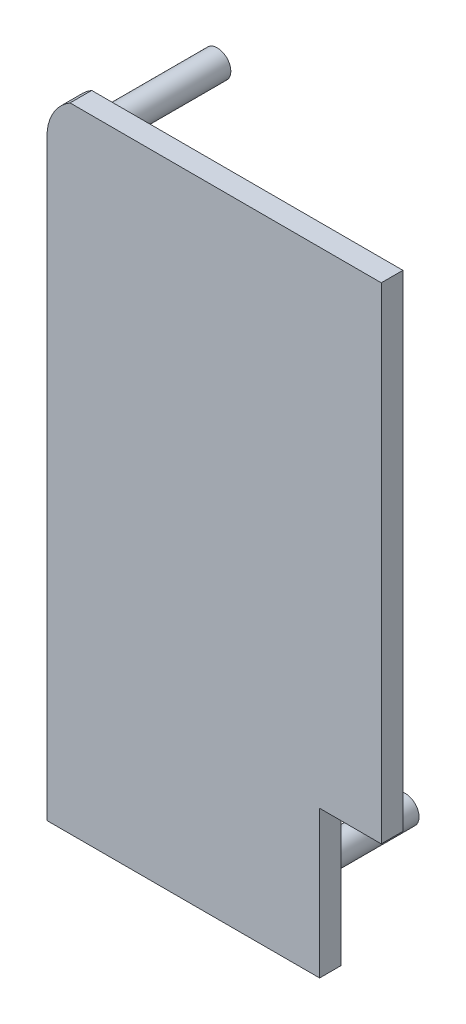
ISO-10303-21;
HEADER;
FILE_DESCRIPTION(('STEP AP214'),'2;1');
FILE_NAME('part.step','',(''),(''),'','','');
FILE_SCHEMA(('AUTOMOTIVE_DESIGN { 1 0 10303 214 1 1 1 1 }'));
ENDSEC;
DATA;
#1=APPLICATION_CONTEXT('core data for automotive mechanical design processes');
#2=APPLICATION_PROTOCOL_DEFINITION('international standard','automotive_design',2000,#1);
#3=PRODUCT_CONTEXT('',#1,'mechanical');
#4=PRODUCT('Part','Part','',(#3));
#5=PRODUCT_RELATED_PRODUCT_CATEGORY('part','',(#4));
#6=PRODUCT_DEFINITION_FORMATION('','',#4);
#7=PRODUCT_DEFINITION_CONTEXT('part definition',#1,'design');
#8=PRODUCT_DEFINITION('design','',#6,#7);
#9=PRODUCT_DEFINITION_SHAPE('','',#8);
#10=(LENGTH_UNIT() NAMED_UNIT(*) SI_UNIT(.MILLI.,.METRE.));
#11=(NAMED_UNIT(*) PLANE_ANGLE_UNIT() SI_UNIT($,.RADIAN.));
#12=(NAMED_UNIT(*) SI_UNIT($,.STERADIAN.) SOLID_ANGLE_UNIT());
#13=UNCERTAINTY_MEASURE_WITH_UNIT(LENGTH_MEASURE(1.E-05),#10,'distance_accuracy_value','');
#14=(GEOMETRIC_REPRESENTATION_CONTEXT(3) GLOBAL_UNCERTAINTY_ASSIGNED_CONTEXT((#13)) GLOBAL_UNIT_ASSIGNED_CONTEXT((#10,
#11,#12)) REPRESENTATION_CONTEXT('',''));
#15=CARTESIAN_POINT('',(0.,0.,0.));
#16=DIRECTION('',(0.,0.,1.));
#17=DIRECTION('',(1.,0.,0.));
#18=AXIS2_PLACEMENT_3D('',#15,#16,#17);
#19=CARTESIAN_POINT('',(-45.9434915901951,7.47796889221965,1.6));
#20=DIRECTION('',(1.,0.,0.));
#21=DIRECTION('',(0.,0.,-1.));
#22=AXIS2_PLACEMENT_3D('',#19,#20,#21);
#23=PLANE('',#22);
#24=DIRECTION('',(0.,-1.,0.));
#25=VECTOR('',#24,1.);
#26=CARTESIAN_POINT('',(-45.9434915901951,7.47796889221965,0.));
#27=LINE('',#26,#25);
#28=CARTESIAN_POINT('',(-45.9434915901951,7.47796889221965,0.));
#29=VERTEX_POINT('',#28);
#30=CARTESIAN_POINT('',(-45.9434915901951,-3.39610460164966,0.));
#31=VERTEX_POINT('',#30);
#32=EDGE_CURVE('E139',#29,#31,#27,.T.);
#33=ORIENTED_EDGE('',*,*,#32,.F.);
#34=DIRECTION('',(0.,0.,-1.));
#35=VECTOR('',#34,1.);
#36=CARTESIAN_POINT('',(-45.9434915901951,7.47796889221965,1.6));
#37=LINE('',#36,#35);
#38=CARTESIAN_POINT('',(-45.9434915901951,7.47796889221965,1.6));
#39=VERTEX_POINT('',#38);
#40=EDGE_CURVE('E11',#39,#29,#37,.T.);
#41=ORIENTED_EDGE('',*,*,#40,.F.);
#42=DIRECTION('',(0.,-1.,0.));
#43=VECTOR('',#42,1.);
#44=CARTESIAN_POINT('',(-45.9434915901951,7.47796889221965,1.6));
#45=LINE('',#44,#43);
#46=CARTESIAN_POINT('',(-45.9434915901951,-3.39610460164966,1.6));
#47=VERTEX_POINT('',#46);
#48=EDGE_CURVE('E164',#39,#47,#45,.T.);
#49=ORIENTED_EDGE('',*,*,#48,.T.);
#50=DIRECTION('',(0.,0.,-1.));
#51=VECTOR('',#50,1.);
#52=CARTESIAN_POINT('',(-45.9434915901951,-3.39610460164966,1.6));
#53=LINE('',#52,#51);
#54=EDGE_CURVE('E48',#47,#31,#53,.T.);
#55=ORIENTED_EDGE('',*,*,#54,.T.);
#56=EDGE_LOOP('',(#33,#41,#49,#55));
#57=FACE_BOUND('',#56,.T.);
#58=ADVANCED_FACE('F45',(#57),#23,.T.);
#59=CARTESIAN_POINT('',(-41.383181355246,7.47796889221965,1.6));
#60=DIRECTION('',(0.,-1.,0.));
#61=DIRECTION('',(0.,0.,-1.));
#62=AXIS2_PLACEMENT_3D('',#59,#60,#61);
#63=PLANE('',#62);
#64=DIRECTION('',(-1.,0.,0.));
#65=VECTOR('',#64,1.);
#66=CARTESIAN_POINT('',(-41.383181355246,7.47796889221965,0.));
#67=LINE('',#66,#65);
#68=CARTESIAN_POINT('',(-41.383181355246,7.47796889221965,0.));
#69=VERTEX_POINT('',#68);
#70=EDGE_CURVE('E161',#69,#29,#67,.T.);
#71=ORIENTED_EDGE('',*,*,#70,.F.);
#72=DIRECTION('',(0.,0.,-1.));
#73=VECTOR('',#72,1.);
#74=CARTESIAN_POINT('',(-41.383181355246,7.47796889221965,1.6));
#75=LINE('',#74,#73);
#76=CARTESIAN_POINT('',(-41.383181355246,7.47796889221965,1.6));
#77=VERTEX_POINT('',#76);
#78=EDGE_CURVE('E55',#77,#69,#75,.T.);
#79=ORIENTED_EDGE('',*,*,#78,.F.);
#80=DIRECTION('',(-1.,0.,0.));
#81=VECTOR('',#80,1.);
#82=CARTESIAN_POINT('',(-41.383181355246,7.47796889221965,1.6));
#83=LINE('',#82,#81);
#84=EDGE_CURVE('E132',#77,#39,#83,.T.);
#85=ORIENTED_EDGE('',*,*,#84,.T.);
#86=ORIENTED_EDGE('',*,*,#40,.T.);
#87=EDGE_LOOP('',(#71,#79,#85,#86));
#88=FACE_BOUND('',#87,.T.);
#89=ADVANCED_FACE('F179',(#88),#63,.T.);
#90=CARTESIAN_POINT('',(-41.383181355246,43.4261653361641,1.6));
#91=DIRECTION('',(1.,0.,0.));
#92=DIRECTION('',(0.,0.,-1.));
#93=AXIS2_PLACEMENT_3D('',#90,#91,#92);
#94=PLANE('',#93);
#95=DIRECTION('',(0.,-1.,0.));
#96=VECTOR('',#95,1.);
#97=CARTESIAN_POINT('',(-41.383181355246,43.4261653361641,0.));
#98=LINE('',#97,#96);
#99=CARTESIAN_POINT('',(-41.383181355246,43.4261653361641,0.));
#100=VERTEX_POINT('',#99);
#101=EDGE_CURVE('E115',#100,#69,#98,.T.);
#102=ORIENTED_EDGE('',*,*,#101,.F.);
#103=DIRECTION('',(0.,0.,-1.));
#104=VECTOR('',#103,1.);
#105=CARTESIAN_POINT('',(-41.383181355246,43.4261653361641,1.6));
#106=LINE('',#105,#104);
#107=CARTESIAN_POINT('',(-41.383181355246,43.4261653361641,1.6));
#108=VERTEX_POINT('',#107);
#109=EDGE_CURVE('E109',#108,#100,#106,.T.);
#110=ORIENTED_EDGE('',*,*,#109,.F.);
#111=DIRECTION('',(0.,-1.,0.));
#112=VECTOR('',#111,1.);
#113=CARTESIAN_POINT('',(-41.383181355246,43.4261653361641,1.6));
#114=LINE('',#113,#112);
#115=EDGE_CURVE('E113',#108,#77,#114,.T.);
#116=ORIENTED_EDGE('',*,*,#115,.T.);
#117=ORIENTED_EDGE('',*,*,#78,.T.);
#118=EDGE_LOOP('',(#102,#110,#116,#117));
#119=FACE_BOUND('',#118,.T.);
#120=ADVANCED_FACE('F111',(#119),#94,.T.);
#121=CARTESIAN_POINT('',(-41.383181355246,43.4261653361641,1.6));
#122=DIRECTION('',(-0.000624025162130426,-0.99999980529628,0.));
#123=DIRECTION('',(0.99999980529628,-0.000624025162130427,0.));
#124=AXIS2_PLACEMENT_3D('',#121,#122,#123);
#125=PLANE('',#124);
#126=DIRECTION('',(-0.99999980529628,0.000624025162130426,0.));
#127=VECTOR('',#126,1.);
#128=CARTESIAN_POINT('',(-41.383181355246,43.4261653361641,0.));
#129=LINE('',#128,#127);
#130=CARTESIAN_POINT('',(-64.4067091317631,43.440532599615,0.));
#131=VERTEX_POINT('',#130);
#132=EDGE_CURVE('E156',#100,#131,#129,.T.);
#133=ORIENTED_EDGE('',*,*,#132,.T.);
#134=DIRECTION('',(0.,0.,-1.));
#135=VECTOR('',#134,1.);
#136=CARTESIAN_POINT('',(-64.4067091317631,43.440532599615,1.6));
#137=LINE('',#136,#135);
#138=CARTESIAN_POINT('',(-64.4067091317631,43.440532599615,1.6));
#139=VERTEX_POINT('',#138);
#140=EDGE_CURVE('E120',#139,#131,#137,.T.);
#141=ORIENTED_EDGE('',*,*,#140,.F.);
#142=DIRECTION('',(-0.99999980529628,0.000624025162130426,0.));
#143=VECTOR('',#142,1.);
#144=CARTESIAN_POINT('',(-41.383181355246,43.4261653361641,1.6));
#145=LINE('',#144,#143);
#146=EDGE_CURVE('E123',#108,#139,#145,.T.);
#147=ORIENTED_EDGE('',*,*,#146,.F.);
#148=ORIENTED_EDGE('',*,*,#109,.T.);
#149=EDGE_LOOP('',(#133,#141,#147,#148));
#150=FACE_BOUND('',#149,.T.);
#151=ADVANCED_FACE('F124',(#150),#125,.F.);
#152=CARTESIAN_POINT('',(-62.6228507692686,40.4405331916471,1.6));
#153=DIRECTION('',(0.,0.,-1.));
#154=DIRECTION('',(-1.,0.,0.));
#155=AXIS2_PLACEMENT_3D('',#152,#153,#154);
#156=CYLINDRICAL_SURFACE('',#155,3.49029326923249);
#157=CARTESIAN_POINT('',(-62.6228507692686,40.4405331916471,0.));
#158=DIRECTION('',(0.,0.,-1.));
#159=DIRECTION('',(-1.,0.,0.));
#160=AXIS2_PLACEMENT_3D('',#157,#158,#159);
#161=CIRCLE('',#160,3.49029326923249);
#162=CARTESIAN_POINT('',(-66.1131440385011,40.4405331916471,0.));
#163=VERTEX_POINT('',#162);
#164=EDGE_CURVE('E152',#163,#131,#161,.T.);
#165=ORIENTED_EDGE('',*,*,#164,.F.);
#166=DIRECTION('',(0.,0.,-1.));
#167=VECTOR('',#166,1.);
#168=CARTESIAN_POINT('',(-66.1131440385011,40.4405331916471,1.6));
#169=LINE('',#168,#167);
#170=CARTESIAN_POINT('',(-66.1131440385011,40.4405331916471,1.6));
#171=VERTEX_POINT('',#170);
#172=EDGE_CURVE('E170',#171,#163,#169,.T.);
#173=ORIENTED_EDGE('',*,*,#172,.F.);
#174=CARTESIAN_POINT('',(-62.6228507692686,40.4405331916471,1.6));
#175=DIRECTION('',(0.,0.,-1.));
#176=DIRECTION('',(-1.,0.,0.));
#177=AXIS2_PLACEMENT_3D('',#174,#175,#176);
#178=CIRCLE('',#177,3.49029326923249);
#179=EDGE_CURVE('E129',#171,#139,#178,.T.);
#180=ORIENTED_EDGE('',*,*,#179,.T.);
#181=ORIENTED_EDGE('',*,*,#140,.T.);
#182=EDGE_LOOP('',(#165,#173,#180,#181));
#183=FACE_BOUND('',#182,.T.);
#184=ADVANCED_FACE('F192',(#183),#156,.T.);
#185=CARTESIAN_POINT('',(-66.1131440385011,-3.39610460164966,1.6));
#186=DIRECTION('',(-1.,0.,0.));
#187=DIRECTION('',(0.,0.,1.));
#188=AXIS2_PLACEMENT_3D('',#185,#186,#187);
#189=PLANE('',#188);
#190=DIRECTION('',(0.,1.,0.));
#191=VECTOR('',#190,1.);
#192=CARTESIAN_POINT('',(-66.1131440385011,-3.39610460164966,0.));
#193=LINE('',#192,#191);
#194=CARTESIAN_POINT('',(-66.1131440385011,-3.39610460164966,0.));
#195=VERTEX_POINT('',#194);
#196=EDGE_CURVE('E148',#195,#163,#193,.T.);
#197=ORIENTED_EDGE('',*,*,#196,.F.);
#198=DIRECTION('',(0.,0.,-1.));
#199=VECTOR('',#198,1.);
#200=CARTESIAN_POINT('',(-66.1131440385011,-3.39610460164966,1.6));
#201=LINE('',#200,#199);
#202=CARTESIAN_POINT('',(-66.1131440385011,-3.39610460164966,1.6));
#203=VERTEX_POINT('',#202);
#204=EDGE_CURVE('E172',#203,#195,#201,.T.);
#205=ORIENTED_EDGE('',*,*,#204,.F.);
#206=DIRECTION('',(0.,1.,0.));
#207=VECTOR('',#206,1.);
#208=CARTESIAN_POINT('',(-66.1131440385011,-3.39610460164966,1.6));
#209=LINE('',#208,#207);
#210=EDGE_CURVE('E263',#203,#171,#209,.T.);
#211=ORIENTED_EDGE('',*,*,#210,.T.);
#212=ORIENTED_EDGE('',*,*,#172,.T.);
#213=EDGE_LOOP('',(#197,#205,#211,#212));
#214=FACE_BOUND('',#213,.T.);
#215=ADVANCED_FACE('F195',(#214),#189,.T.);
#216=CARTESIAN_POINT('',(-45.9434915901951,-3.39610460164966,1.6));
#217=DIRECTION('',(0.,-1.,0.));
#218=DIRECTION('',(0.,0.,-1.));
#219=AXIS2_PLACEMENT_3D('',#216,#217,#218);
#220=PLANE('',#219);
#221=DIRECTION('',(-1.,0.,0.));
#222=VECTOR('',#221,1.);
#223=CARTESIAN_POINT('',(-45.9434915901951,-3.39610460164966,0.));
#224=LINE('',#223,#222);
#225=EDGE_CURVE('E143',#31,#195,#224,.T.);
#226=ORIENTED_EDGE('',*,*,#225,.F.);
#227=ORIENTED_EDGE('',*,*,#54,.F.);
#228=DIRECTION('',(-1.,0.,0.));
#229=VECTOR('',#228,1.);
#230=CARTESIAN_POINT('',(-45.9434915901951,-3.39610460164966,1.6));
#231=LINE('',#230,#229);
#232=EDGE_CURVE('E260',#47,#203,#231,.T.);
#233=ORIENTED_EDGE('',*,*,#232,.T.);
#234=ORIENTED_EDGE('',*,*,#204,.T.);
#235=EDGE_LOOP('',(#226,#227,#233,#234));
#236=FACE_BOUND('',#235,.T.);
#237=ADVANCED_FACE('F176',(#236),#220,.T.);
#238=CARTESIAN_POINT('',(-62.6228507692686,40.4405331916471,1.6));
#239=DIRECTION('',(0.,0.,-1.));
#240=DIRECTION('',(-1.,0.,0.));
#241=AXIS2_PLACEMENT_3D('',#238,#239,#240);
#242=PLANE('',#241);
#243=ORIENTED_EDGE('',*,*,#48,.F.);
#244=ORIENTED_EDGE('',*,*,#84,.F.);
#245=ORIENTED_EDGE('',*,*,#115,.F.);
#246=ORIENTED_EDGE('',*,*,#146,.T.);
#247=ORIENTED_EDGE('',*,*,#179,.F.);
#248=ORIENTED_EDGE('',*,*,#210,.F.);
#249=ORIENTED_EDGE('',*,*,#232,.F.);
#250=EDGE_LOOP('',(#243,#244,#245,#246,#247,#248,#249));
#251=FACE_BOUND('',#250,.T.);
#252=ADVANCED_FACE('F131',(#251),#242,.F.);
#253=CARTESIAN_POINT('',(-62.6228507692686,40.4405331916471,0.));
#254=DIRECTION('',(0.,0.,-1.));
#255=DIRECTION('',(-1.,0.,0.));
#256=AXIS2_PLACEMENT_3D('',#253,#254,#255);
#257=PLANE('',#256);
#258=CARTESIAN_POINT('',(-50.1890005430533,0.,0.));
#259=DIRECTION('',(0.,0.,-1.));
#260=DIRECTION('',(-1.,0.,0.));
#261=AXIS2_PLACEMENT_3D('',#258,#259,#260);
#262=CIRCLE('',#261,0.999999999999998);
#263=CARTESIAN_POINT('',(-51.1890005430533,0.,0.));
#264=VERTEX_POINT('',#263);
#265=EDGE_CURVE('E236',#264,#264,#262,.T.);
#266=ORIENTED_EDGE('',*,*,#265,.F.);
#267=EDGE_LOOP('',(#266));
#268=FACE_BOUND('',#267,.T.);
#269=CARTESIAN_POINT('',(-60.9289284458091,0.,0.));
#270=DIRECTION('',(0.,0.,-1.));
#271=DIRECTION('',(-1.,0.,0.));
#272=AXIS2_PLACEMENT_3D('',#269,#270,#271);
#273=CIRCLE('',#272,0.999999999999998);
#274=CARTESIAN_POINT('',(-61.9289284458091,0.,0.));
#275=VERTEX_POINT('',#274);
#276=EDGE_CURVE('E240',#275,#275,#273,.T.);
#277=ORIENTED_EDGE('',*,*,#276,.F.);
#278=EDGE_LOOP('',(#277));
#279=FACE_BOUND('',#278,.T.);
#280=CARTESIAN_POINT('',(-64.1134419518588,40.8152139502483,0.));
#281=DIRECTION('',(0.,0.,-1.));
#282=DIRECTION('',(-1.,0.,0.));
#283=AXIS2_PLACEMENT_3D('',#280,#281,#282);
#284=CIRCLE('',#283,0.999999999999998);
#285=CARTESIAN_POINT('',(-65.1134419518588,40.8152139502483,0.));
#286=VERTEX_POINT('',#285);
#287=EDGE_CURVE('E250',#286,#286,#284,.T.);
#288=ORIENTED_EDGE('',*,*,#287,.F.);
#289=EDGE_LOOP('',(#288));
#290=FACE_BOUND('',#289,.T.);
#291=ORIENTED_EDGE('',*,*,#32,.T.);
#292=ORIENTED_EDGE('',*,*,#225,.T.);
#293=ORIENTED_EDGE('',*,*,#196,.T.);
#294=ORIENTED_EDGE('',*,*,#164,.T.);
#295=ORIENTED_EDGE('',*,*,#132,.F.);
#296=ORIENTED_EDGE('',*,*,#101,.T.);
#297=ORIENTED_EDGE('',*,*,#70,.T.);
#298=EDGE_LOOP('',(#291,#292,#293,#294,#295,#296,#297));
#299=FACE_BOUND('',#298,.T.);
#300=ADVANCED_FACE('F178',(#268,#279,#290,#299),#257,.T.);
#301=CARTESIAN_POINT('',(-64.1134419518588,40.8152139502483,-9.));
#302=DIRECTION('',(0.,0.,1.));
#303=DIRECTION('',(1.,0.,0.));
#304=AXIS2_PLACEMENT_3D('',#301,#302,#303);
#305=CYLINDRICAL_SURFACE('',#304,0.999999999999998);
#306=CARTESIAN_POINT('',(-64.1134419518588,40.8152139502483,-9.));
#307=DIRECTION('',(0.,0.,-1.));
#308=DIRECTION('',(-1.,0.,0.));
#309=AXIS2_PLACEMENT_3D('',#306,#307,#308);
#310=CIRCLE('',#309,0.999999999999998);
#311=CARTESIAN_POINT('',(-65.1134419518588,40.8152139502483,-9.));
#312=VERTEX_POINT('',#311);
#313=EDGE_CURVE('E254',#312,#312,#310,.T.);
#314=ORIENTED_EDGE('',*,*,#313,.F.);
#315=EDGE_LOOP('',(#314));
#316=FACE_BOUND('',#315,.T.);
#317=ORIENTED_EDGE('',*,*,#287,.T.);
#318=EDGE_LOOP('',(#317));
#319=FACE_BOUND('',#318,.T.);
#320=ADVANCED_FACE('F206',(#316,#319),#305,.T.);
#321=CARTESIAN_POINT('',(-64.1134419518588,40.8152139502483,-9.));
#322=DIRECTION('',(0.,0.,-1.));
#323=DIRECTION('',(-1.,0.,0.));
#324=AXIS2_PLACEMENT_3D('',#321,#322,#323);
#325=PLANE('',#324);
#326=ORIENTED_EDGE('',*,*,#313,.T.);
#327=EDGE_LOOP('',(#326));
#328=FACE_BOUND('',#327,.T.);
#329=ADVANCED_FACE('F209',(#328),#325,.T.);
#330=CARTESIAN_POINT('',(-60.9289284458091,0.,-9.));
#331=DIRECTION('',(0.,0.,1.));
#332=DIRECTION('',(1.,0.,0.));
#333=AXIS2_PLACEMENT_3D('',#330,#331,#332);
#334=CYLINDRICAL_SURFACE('',#333,0.999999999999998);
#335=CARTESIAN_POINT('',(-60.9289284458091,0.,-9.));
#336=DIRECTION('',(0.,0.,-1.));
#337=DIRECTION('',(-1.,0.,0.));
#338=AXIS2_PLACEMENT_3D('',#335,#336,#337);
#339=CIRCLE('',#338,0.999999999999998);
#340=CARTESIAN_POINT('',(-61.9289284458091,0.,-9.));
#341=VERTEX_POINT('',#340);
#342=EDGE_CURVE('E246',#341,#341,#339,.T.);
#343=ORIENTED_EDGE('',*,*,#342,.F.);
#344=EDGE_LOOP('',(#343));
#345=FACE_BOUND('',#344,.T.);
#346=ORIENTED_EDGE('',*,*,#276,.T.);
#347=EDGE_LOOP('',(#346));
#348=FACE_BOUND('',#347,.T.);
#349=ADVANCED_FACE('F212',(#345,#348),#334,.T.);
#350=CARTESIAN_POINT('',(-60.9289284458091,0.,-9.));
#351=DIRECTION('',(0.,0.,-1.));
#352=DIRECTION('',(-1.,0.,0.));
#353=AXIS2_PLACEMENT_3D('',#350,#351,#352);
#354=PLANE('',#353);
#355=ORIENTED_EDGE('',*,*,#342,.T.);
#356=EDGE_LOOP('',(#355));
#357=FACE_BOUND('',#356,.T.);
#358=ADVANCED_FACE('F217',(#357),#354,.T.);
#359=CARTESIAN_POINT('',(-50.1890005430533,0.,-9.));
#360=DIRECTION('',(0.,0.,1.));
#361=DIRECTION('',(1.,0.,0.));
#362=AXIS2_PLACEMENT_3D('',#359,#360,#361);
#363=CYLINDRICAL_SURFACE('',#362,0.999999999999998);
#364=CARTESIAN_POINT('',(-50.1890005430533,0.,-9.));
#365=DIRECTION('',(0.,0.,-1.));
#366=DIRECTION('',(-1.,0.,0.));
#367=AXIS2_PLACEMENT_3D('',#364,#365,#366);
#368=CIRCLE('',#367,0.999999999999998);
#369=CARTESIAN_POINT('',(-51.1890005430533,0.,-9.));
#370=VERTEX_POINT('',#369);
#371=EDGE_CURVE('E144',#370,#370,#368,.T.);
#372=ORIENTED_EDGE('',*,*,#371,.F.);
#373=EDGE_LOOP('',(#372));
#374=FACE_BOUND('',#373,.T.);
#375=ORIENTED_EDGE('',*,*,#265,.T.);
#376=EDGE_LOOP('',(#375));
#377=FACE_BOUND('',#376,.T.);
#378=ADVANCED_FACE('F220',(#374,#377),#363,.T.);
#379=CARTESIAN_POINT('',(-50.1890005430533,0.,-9.));
#380=DIRECTION('',(0.,0.,-1.));
#381=DIRECTION('',(-1.,0.,0.));
#382=AXIS2_PLACEMENT_3D('',#379,#380,#381);
#383=PLANE('',#382);
#384=ORIENTED_EDGE('',*,*,#371,.T.);
#385=EDGE_LOOP('',(#384));
#386=FACE_BOUND('',#385,.T.);
#387=ADVANCED_FACE('F227',(#386),#383,.T.);
#388=CLOSED_SHELL('',(#58,#89,#120,#151,#184,#215,#237,#252,#300,#320,#329,#349,#358,#378,#387));
#389=MANIFOLD_SOLID_BREP('B2',#388);
#390=ADVANCED_BREP_SHAPE_REPRESENTATION('',(#18,#389),#14);
#391=SHAPE_DEFINITION_REPRESENTATION(#9,#390);
ENDSEC;
END-ISO-10303-21;
